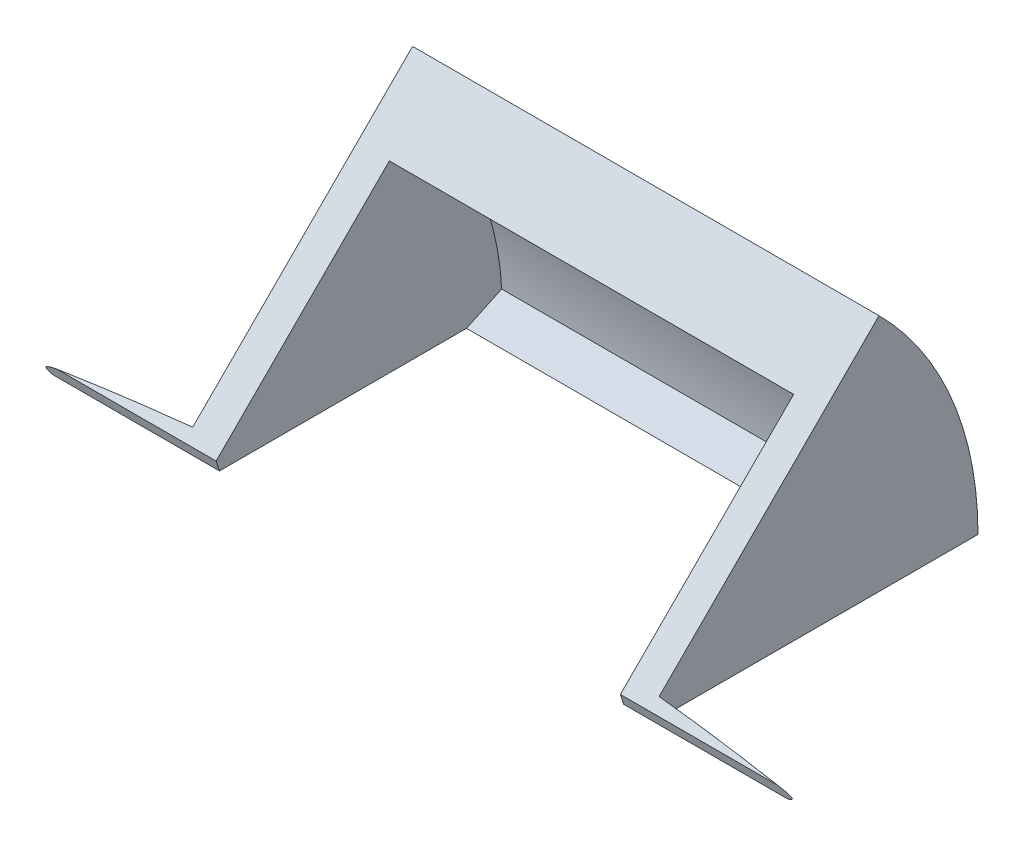
ISO-10303-21;
HEADER;
FILE_DESCRIPTION(('STEP AP214'),'2;1');
FILE_NAME('part.step','',(''),(''),'','','');
FILE_SCHEMA(('AUTOMOTIVE_DESIGN { 1 0 10303 214 1 1 1 1 }'));
ENDSEC;
DATA;
#1=APPLICATION_CONTEXT('core data for automotive mechanical design processes');
#2=APPLICATION_PROTOCOL_DEFINITION('international standard','automotive_design',2000,#1);
#3=PRODUCT_CONTEXT('',#1,'mechanical');
#4=PRODUCT('Part','Part','',(#3));
#5=PRODUCT_RELATED_PRODUCT_CATEGORY('part','',(#4));
#6=PRODUCT_DEFINITION_FORMATION('','',#4);
#7=PRODUCT_DEFINITION_CONTEXT('part definition',#1,'design');
#8=PRODUCT_DEFINITION('design','',#6,#7);
#9=PRODUCT_DEFINITION_SHAPE('','',#8);
#10=(LENGTH_UNIT() NAMED_UNIT(*) SI_UNIT(.MILLI.,.METRE.));
#11=(NAMED_UNIT(*) PLANE_ANGLE_UNIT() SI_UNIT($,.RADIAN.));
#12=(NAMED_UNIT(*) SI_UNIT($,.STERADIAN.) SOLID_ANGLE_UNIT());
#13=UNCERTAINTY_MEASURE_WITH_UNIT(LENGTH_MEASURE(1.E-05),#10,'distance_accuracy_value','');
#14=(GEOMETRIC_REPRESENTATION_CONTEXT(3) GLOBAL_UNCERTAINTY_ASSIGNED_CONTEXT((#13)) GLOBAL_UNIT_ASSIGNED_CONTEXT((#10,
#11,#12)) REPRESENTATION_CONTEXT('',''));
#15=CARTESIAN_POINT('',(0.,0.,0.));
#16=DIRECTION('',(0.,0.,1.));
#17=DIRECTION('',(1.,0.,0.));
#18=AXIS2_PLACEMENT_3D('',#15,#16,#17);
#19=CARTESIAN_POINT('',(1.29664247119215E-12,-696.664748103443,-288.567987091697));
#20=DIRECTION('',(0.,0.707106781186522,0.707106781186573));
#21=DIRECTION('',(0.,-0.707106781186573,0.707106781186522));
#22=AXIS2_PLACEMENT_3D('',#19,#20,#21);
#23=PLANE('',#22);
#24=DIRECTION('',(0.,0.707106781186573,-0.707106781186522));
#25=VECTOR('',#24,1.);
#26=CARTESIAN_POINT('',(66.4075056015437,-696.664748103443,-288.567987091697));
#27=LINE('',#26,#25);
#28=CARTESIAN_POINT('',(66.4075056015471,3.35345131118925,-988.586186506279));
#29=VERTEX_POINT('',#28);
#30=CARTESIAN_POINT('',(66.4075056015471,59.9622891074173,-1045.1950243025));
#31=VERTEX_POINT('',#30);
#32=EDGE_CURVE('E155',#29,#31,#27,.T.);
#33=ORIENTED_EDGE('',*,*,#32,.F.);
#34=DIRECTION('',(-1.,0.,0.));
#35=VECTOR('',#34,1.);
#36=CARTESIAN_POINT('',(285.355505601547,3.35345131118925,-988.586186506278));
#37=LINE('',#36,#35);
#38=CARTESIAN_POINT('',(117.721465657979,3.3534513111893,-988.586186506279));
#39=VERTEX_POINT('',#38);
#40=EDGE_CURVE('E144',#29,#39,#37,.F.);
#41=ORIENTED_EDGE('',*,*,#40,.T.);
#42=CARTESIAN_POINT('',(1.29664247119215E-12,-696.664748103443,-288.567987091697));
#43=DIRECTION('',(0.,0.707106781186522,0.707106781186573));
#44=DIRECTION('',(0.,-0.707106781186573,0.707106781186522));
#45=AXIS2_PLACEMENT_3D('',#42,#43,#44);
#46=CIRCLE('',#45,996.95);
#47=CARTESIAN_POINT('',(76.2,6.22317415019435,-991.455909345284));
#48=VERTEX_POINT('',#47);
#49=EDGE_CURVE('E152',#39,#48,#46,.T.);
#50=ORIENTED_EDGE('',*,*,#49,.T.);
#51=DIRECTION('',(0.,0.707106781186573,-0.707106781186522));
#52=VECTOR('',#51,1.);
#53=CARTESIAN_POINT('',(76.2,6.22317415019435,-991.455909345284));
#54=LINE('',#53,#52);
#55=CARTESIAN_POINT('',(76.1999999999998,78.0652231187502,-1063.29795831383));
#56=VERTEX_POINT('',#55);
#57=EDGE_CURVE('E162',#48,#56,#54,.T.);
#58=ORIENTED_EDGE('',*,*,#57,.T.);
#59=DIRECTION('',(-1.,0.,0.));
#60=VECTOR('',#59,1.);
#61=CARTESIAN_POINT('',(76.1999999999998,78.0652231187502,-1063.29795831383));
#62=LINE('',#61,#60);
#63=CARTESIAN_POINT('',(-76.2000000000002,78.0652231187497,-1063.29795831383));
#64=VERTEX_POINT('',#63);
#65=EDGE_CURVE('E165',#56,#64,#62,.T.);
#66=ORIENTED_EDGE('',*,*,#65,.T.);
#67=DIRECTION('',(0.,-0.707106781186573,0.707106781186522));
#68=VECTOR('',#67,1.);
#69=CARTESIAN_POINT('',(-76.2000000000002,78.0652231187497,-1063.29795831383));
#70=LINE('',#69,#68);
#71=CARTESIAN_POINT('',(-76.2,6.22317415019391,-991.455909345284));
#72=VERTEX_POINT('',#71);
#73=EDGE_CURVE('E175',#64,#72,#70,.T.);
#74=ORIENTED_EDGE('',*,*,#73,.T.);
#75=CARTESIAN_POINT('',(1.29664247119215E-12,-696.664748103443,-288.567987091697));
#76=DIRECTION('',(0.,0.707106781186522,0.707106781186573));
#77=DIRECTION('',(0.,-0.707106781186573,0.707106781186522));
#78=AXIS2_PLACEMENT_3D('',#75,#76,#77);
#79=CIRCLE('',#78,996.95);
#80=CARTESIAN_POINT('',(-117.72146565797,3.35345131118933,-988.58618650628));
#81=VERTEX_POINT('',#80);
#82=EDGE_CURVE('E178',#72,#81,#79,.T.);
#83=ORIENTED_EDGE('',*,*,#82,.T.);
#84=DIRECTION('',(1.,0.,0.));
#85=VECTOR('',#84,1.);
#86=CARTESIAN_POINT('',(-197.752494398453,3.35345131118925,-988.58618650628));
#87=LINE('',#86,#85);
#88=CARTESIAN_POINT('',(-65.6724943984531,3.35345131118925,-988.58618650628));
#89=VERTEX_POINT('',#88);
#90=EDGE_CURVE('E235',#89,#81,#87,.F.);
#91=ORIENTED_EDGE('',*,*,#90,.F.);
#92=DIRECTION('',(0.,-0.707106781186573,0.707106781186522));
#93=VECTOR('',#92,1.);
#94=CARTESIAN_POINT('',(-65.6724943984563,-696.664748103443,-288.567987091697));
#95=LINE('',#94,#93);
#96=CARTESIAN_POINT('',(-65.6724943984529,59.9622891074173,-1045.1950243025));
#97=VERTEX_POINT('',#96);
#98=EDGE_CURVE('E226',#97,#89,#95,.T.);
#99=ORIENTED_EDGE('',*,*,#98,.F.);
#100=DIRECTION('',(1.,0.,0.));
#101=VECTOR('',#100,1.);
#102=CARTESIAN_POINT('',(-65.6724943984528,59.9622891074152,-1045.19502430251));
#103=LINE('',#102,#101);
#104=EDGE_CURVE('E163',#97,#31,#103,.T.);
#105=ORIENTED_EDGE('',*,*,#104,.T.);
#106=EDGE_LOOP('',(#33,#41,#50,#58,#66,#74,#83,#91,#99,#105));
#107=FACE_BOUND('',#106,.T.);
#108=ADVANCED_FACE('F34',(#107),#23,.T.);
#109=CARTESIAN_POINT('',(0.,0.,0.));
#110=DIRECTION('',(0.,1.,0.));
#111=DIRECTION('',(0.,0.,1.));
#112=AXIS2_PLACEMENT_3D('',#109,#110,#111);
#113=PLANE('',#112);
#114=DIRECTION('',(-1.,0.,0.));
#115=VECTOR('',#114,1.);
#116=CARTESIAN_POINT('',(285.355505601547,0.,-989.69301381874));
#117=LINE('',#116,#115);
#118=CARTESIAN_POINT('',(66.4075056015472,0.,-989.69301381874));
#119=VERTEX_POINT('',#118);
#120=CARTESIAN_POINT('',(120.070982749284,0.,-989.69301381874));
#121=VERTEX_POINT('',#120);
#122=EDGE_CURVE('E54',#119,#121,#117,.F.);
#123=ORIENTED_EDGE('',*,*,#122,.F.);
#124=DIRECTION('',(0.,0.,-1.));
#125=VECTOR('',#124,1.);
#126=CARTESIAN_POINT('',(66.4075056015424,0.,2.98367811087682E-13));
#127=LINE('',#126,#125);
#128=CARTESIAN_POINT('',(66.4075056015471,0.,-1070.3809892374));
#129=VERTEX_POINT('',#128);
#130=EDGE_CURVE('E198',#119,#129,#127,.T.);
#131=ORIENTED_EDGE('',*,*,#130,.T.);
#132=DIRECTION('',(-1.,0.,0.));
#133=VECTOR('',#132,1.);
#134=CARTESIAN_POINT('',(66.4075056015471,0.,-1070.3809892374));
#135=LINE('',#134,#133);
#136=CARTESIAN_POINT('',(-65.6724943984528,0.,-1070.3809892374));
#137=VERTEX_POINT('',#136);
#138=EDGE_CURVE('E200',#129,#137,#135,.T.);
#139=ORIENTED_EDGE('',*,*,#138,.T.);
#140=DIRECTION('',(0.,0.,1.));
#141=VECTOR('',#140,1.);
#142=CARTESIAN_POINT('',(-65.6724943984576,0.,-2.95065418055406E-13));
#143=LINE('',#142,#141);
#144=CARTESIAN_POINT('',(-65.6724943984531,0.,-989.693013818741));
#145=VERTEX_POINT('',#144);
#146=EDGE_CURVE('E181',#137,#145,#143,.T.);
#147=ORIENTED_EDGE('',*,*,#146,.T.);
#148=DIRECTION('',(1.,0.,0.));
#149=VECTOR('',#148,1.);
#150=CARTESIAN_POINT('',(-197.752494398453,0.,-989.693013818742));
#151=LINE('',#150,#149);
#152=CARTESIAN_POINT('',(-120.070982749275,0.,-989.693013818741));
#153=VERTEX_POINT('',#152);
#154=EDGE_CURVE('E197',#145,#153,#151,.F.);
#155=ORIENTED_EDGE('',*,*,#154,.T.);
#156=CARTESIAN_POINT('',(0.,0.,0.));
#157=DIRECTION('',(0.,1.,0.));
#158=DIRECTION('',(0.,0.,1.));
#159=AXIS2_PLACEMENT_3D('',#156,#157,#158);
#160=CIRCLE('',#159,996.95);
#161=CARTESIAN_POINT('',(-76.2,0.,-994.033632479304));
#162=VERTEX_POINT('',#161);
#163=EDGE_CURVE('E170',#162,#153,#160,.T.);
#164=ORIENTED_EDGE('',*,*,#163,.F.);
#165=DIRECTION('',(0.,0.,1.));
#166=VECTOR('',#165,1.);
#167=CARTESIAN_POINT('',(-76.2,0.,-1095.6336324793));
#168=LINE('',#167,#166);
#169=CARTESIAN_POINT('',(-76.2,0.,-1095.6336324793));
#170=VERTEX_POINT('',#169);
#171=EDGE_CURVE('E188',#170,#162,#168,.T.);
#172=ORIENTED_EDGE('',*,*,#171,.F.);
#173=DIRECTION('',(-1.,0.,0.));
#174=VECTOR('',#173,1.);
#175=CARTESIAN_POINT('',(76.2,0.,-1095.6336324793));
#176=LINE('',#175,#174);
#177=CARTESIAN_POINT('',(76.2,0.,-1095.6336324793));
#178=VERTEX_POINT('',#177);
#179=EDGE_CURVE('E189',#178,#170,#176,.T.);
#180=ORIENTED_EDGE('',*,*,#179,.F.);
#181=DIRECTION('',(0.,0.,-1.));
#182=VECTOR('',#181,1.);
#183=CARTESIAN_POINT('',(76.2,0.,-994.033632479304));
#184=LINE('',#183,#182);
#185=CARTESIAN_POINT('',(76.2,0.,-994.033632479304));
#186=VERTEX_POINT('',#185);
#187=EDGE_CURVE('E192',#186,#178,#184,.T.);
#188=ORIENTED_EDGE('',*,*,#187,.F.);
#189=CARTESIAN_POINT('',(0.,0.,0.));
#190=DIRECTION('',(0.,1.,0.));
#191=DIRECTION('',(0.,0.,1.));
#192=AXIS2_PLACEMENT_3D('',#189,#190,#191);
#193=CIRCLE('',#192,996.95);
#194=EDGE_CURVE('E194',#121,#186,#193,.T.);
#195=ORIENTED_EDGE('',*,*,#194,.F.);
#196=EDGE_LOOP('',(#123,#131,#139,#147,#155,#164,#172,#180,#188,#195));
#197=FACE_BOUND('',#196,.T.);
#198=ADVANCED_FACE('F258',(#197),#113,.F.);
#199=CARTESIAN_POINT('',(4.43302251575821E-12,0.,-985.23273519509));
#200=DIRECTION('',(-1.,0.,0.));
#201=DIRECTION('',(0.,0.,1.));
#202=AXIS2_PLACEMENT_3D('',#199,#200,#201);
#203=DEGENERATE_TOROIDAL_SURFACE('',#202,985.23273519509,996.95,.F.);
#204=CARTESIAN_POINT('',(113.94406529284,-1.51833179622316,-990.189792221025));
#205=CARTESIAN_POINT('',(114.195517946914,-1.47048861441337,-990.174181212189));
#206=CARTESIAN_POINT('',(114.446784585721,-1.42174603889642,-990.158272802068));
#207=CARTESIAN_POINT('',(114.948875364924,-1.32210671711397,-990.125743941695));
#208=CARTESIAN_POINT('',(115.199699448079,-1.27120971082005,-990.10912340549));
#209=CARTESIAN_POINT('',(115.701919002821,-1.16667918255137,-990.074978914639));
#210=CARTESIAN_POINT('',(115.953311845013,-1.11303421476979,-990.057451177527));
#211=CARTESIAN_POINT('',(116.455346394734,-1.00272900072707,-990.02139951206));
#212=CARTESIAN_POINT('',(116.705988155373,-0.946068973245289,-990.002875655985));
#213=CARTESIAN_POINT('',(117.219668178462,-0.825939250416111,-989.963588938114));
#214=CARTESIAN_POINT('',(117.482654451895,-0.762267528454908,-989.942759349107));
#215=CARTESIAN_POINT('',(118.007224269679,-0.629677509559354,-989.899367783484));
#216=CARTESIAN_POINT('',(118.268807500985,-0.560758089960621,-989.876805436162));
#217=CARTESIAN_POINT('',(118.789336027187,-0.416100732067048,-989.829429414151));
#218=CARTESIAN_POINT('',(119.048285621161,-0.340377018826363,-989.804620435458));
#219=CARTESIAN_POINT('',(119.434073793415,-0.219346826533982,-989.764949787061));
#220=CARTESIAN_POINT('',(119.562207952772,-0.177770705223099,-989.751319346998));
#221=CARTESIAN_POINT('',(119.817311466487,-0.0915216429093998,-989.723036423215));
#222=CARTESIAN_POINT('',(119.944280945797,-0.0468490386197794,-989.70838405062));
#223=CARTESIAN_POINT('',(120.157041130226,0.0318207901941326,-989.68257405439));
#224=CARTESIAN_POINT('',(120.243259424288,0.0647728192321065,-989.671761355817));
#225=CARTESIAN_POINT('',(120.414725683612,0.132947018501499,-989.649386823968));
#226=CARTESIAN_POINT('',(120.499973416736,0.168169718946786,-989.637824815722));
#227=CARTESIAN_POINT('',(120.668637291271,0.241201545098135,-989.613846917769));
#228=CARTESIAN_POINT('',(120.75206123786,0.278994306894178,-989.601436428157));
#229=CARTESIAN_POINT('',(120.917028712373,0.358094624939362,-989.57545552383));
#230=CARTESIAN_POINT('',(120.998572901367,0.399400920824776,-989.561885525042));
#231=CARTESIAN_POINT('',(121.149610820659,0.481625985299725,-989.534866226646));
#232=CARTESIAN_POINT('',(121.219407965142,0.522037676334058,-989.521584277065));
#233=CARTESIAN_POINT('',(121.35605079018,0.607965510016074,-989.493335908331));
#234=CARTESIAN_POINT('',(121.422878912152,0.653507514348653,-989.478360953313));
#235=CARTESIAN_POINT('',(121.552018884215,0.752158266640663,-989.445914041068));
#236=CARTESIAN_POINT('',(121.614232958056,0.805383976165311,-989.428403470888));
#237=CARTESIAN_POINT('',(121.727432724821,0.921658357746014,-989.390137859496));
#238=CARTESIAN_POINT('',(121.778525031737,0.984602875735862,-989.369417212769));
#239=CARTESIAN_POINT('',(121.833953024189,1.08088223273791,-989.337710371997));
#240=CARTESIAN_POINT('',(121.847890108659,1.10913719078718,-989.328404108204));
#241=CARTESIAN_POINT('',(121.871045392107,1.16735159745502,-989.309227071092));
#242=CARTESIAN_POINT('',(121.880268886948,1.19730909096802,-989.299356945218));
#243=CARTESIAN_POINT('',(121.893050013871,1.25861007891947,-989.279156648558));
#244=CARTESIAN_POINT('',(121.89655616614,1.28996358298813,-989.26882314946));
#245=CARTESIAN_POINT('',(121.897238491709,1.35273846085475,-989.248130250736));
#246=CARTESIAN_POINT('',(121.894414219766,1.38415983927128,-989.237770849338));
#247=CARTESIAN_POINT('',(121.883403188042,1.4430015414251,-989.218367974614));
#248=CARTESIAN_POINT('',(121.87575543859,1.47051700933935,-989.209293438269));
#249=CARTESIAN_POINT('',(121.856371543609,1.5241967171067,-989.191587504638));
#250=CARTESIAN_POINT('',(121.844633430736,1.5503602997772,-989.182956322889));
#251=CARTESIAN_POINT('',(121.808380061266,1.61923325117716,-989.160232624539));
#252=CARTESIAN_POINT('',(121.780722310695,1.66043735076755,-989.146634548886));
#253=CARTESIAN_POINT('',(121.719318264499,1.73852893061424,-989.120857902626));
#254=CARTESIAN_POINT('',(121.685550196317,1.77540017070215,-989.108684673179));
#255=CARTESIAN_POINT('',(121.602528947364,1.856912914721,-989.081768084115));
#256=CARTESIAN_POINT('',(121.55180914263,1.90018702063365,-989.067474638778));
#257=CARTESIAN_POINT('',(121.446263674219,1.98201964472908,-989.040439803618));
#258=CARTESIAN_POINT('',(121.391429600326,2.0205680547616,-989.027701740944));
#259=CARTESIAN_POINT('',(121.278829998236,2.09423177467017,-989.003355551371));
#260=CARTESIAN_POINT('',(121.221049621515,2.12932639627823,-988.991754235224));
#261=CARTESIAN_POINT('',(121.103740134054,2.19659894203348,-988.969511964817));
#262=CARTESIAN_POINT('',(121.04421289961,2.22877985415804,-988.958870026773));
#263=CARTESIAN_POINT('',(120.860770956087,2.32342634126685,-988.927566354401));
#264=CARTESIAN_POINT('',(120.734789266682,2.38226606531765,-988.908098486238));
#265=CARTESIAN_POINT('',(120.479699075185,2.49353675797214,-988.871273019535));
#266=CARTESIAN_POINT('',(120.350588288473,2.54596286396296,-988.853917022205));
#267=CARTESIAN_POINT('',(120.090062224509,2.64620685122664,-988.820722213041));
#268=CARTESIAN_POINT('',(119.958642320465,2.69401382941699,-988.804886991384));
#269=CARTESIAN_POINT('',(119.694393169052,2.78599334193724,-988.77441323505));
#270=CARTESIAN_POINT('',(119.561563724715,2.83016536056489,-988.759774870178));
#271=CARTESIAN_POINT('',(119.161242816772,2.95849308938827,-988.717238507323));
#272=CARTESIAN_POINT('',(118.892222518604,3.0383483661885,-988.690756371115));
#273=CARTESIAN_POINT('',(118.487123585887,3.152223058796,-988.65297815011));
#274=CARTESIAN_POINT('',(118.351930138533,3.18917134305036,-988.640717955483));
#275=CARTESIAN_POINT('',(118.081046609695,3.2613828460322,-988.616752183192));
#276=CARTESIAN_POINT('',(117.94535654348,3.29664611610896,-988.605046588626));
#277=CARTESIAN_POINT('',(117.540566610538,3.39954447495341,-988.570883494827));
#278=CARTESIAN_POINT('',(117.270876181876,3.46508304054257,-988.549115940286));
#279=CARTESIAN_POINT('',(116.730355765647,3.59179556444124,-988.507016786381));
#280=CARTESIAN_POINT('',(116.459525720126,3.65296929787118,-988.486685261003));
#281=CARTESIAN_POINT('',(115.645681781599,3.83129370963523,-988.427399844712));
#282=CARTESIAN_POINT('',(115.101400599866,3.94322629227609,-988.390162189445));
#283=CARTESIAN_POINT('',(114.010135956298,4.15756140612789,-988.318818917079));
#284=CARTESIAN_POINT('',(113.46315008927,4.25995271191139,-988.284716989811));
#285=CARTESIAN_POINT('',(112.36777629261,4.45742564726724,-988.21891453302));
#286=CARTESIAN_POINT('',(111.819388502367,4.55250797641334,-988.187213773677));
#287=CARTESIAN_POINT('',(110.722630259704,4.73673948514945,-988.12576132362));
#288=CARTESIAN_POINT('',(110.174261908206,4.82590000176044,-988.096005910454));
#289=CARTESIAN_POINT('',(109.076690755962,4.99952959231751,-988.038034806147));
#290=CARTESIAN_POINT('',(108.527487935624,5.08399855430565,-988.009819151751));
#291=CARTESIAN_POINT('',(107.428681035528,5.24894339507402,-987.954698158013));
#292=CARTESIAN_POINT('',(106.879077261263,5.32942111303674,-987.927792215259));
#293=CARTESIAN_POINT('',(105.779328056162,5.48696998564045,-987.875097720479));
#294=CARTESIAN_POINT('',(105.229182624382,5.56404113433138,-987.849309170405));
#295=CARTESIAN_POINT('',(104.306431553709,5.69074705266428,-987.806895825068));
#296=CARTESIAN_POINT('',(103.933949266338,5.74119389391982,-987.790004690031));
#297=CARTESIAN_POINT('',(103.188772741583,5.8408215998879,-987.756637606665));
#298=CARTESIAN_POINT('',(102.816078492255,5.89000238411501,-987.740161684735));
#299=CARTESIAN_POINT('',(102.070483995807,5.98718826420996,-987.707595422898));
#300=CARTESIAN_POINT('',(101.697583732511,6.03519324820411,-987.691505119686));
#301=CARTESIAN_POINT('',(100.951634472621,6.13009616613208,-987.659687662503));
#302=CARTESIAN_POINT('',(100.578585479053,6.17699412152911,-987.643960501492));
#303=CARTESIAN_POINT('',(99.09800348725,6.36103491760745,-987.582227737957));
#304=CARTESIAN_POINT('',(97.9899102938349,6.49413293501849,-987.537549136444));
#305=CARTESIAN_POINT('',(95.7726968696165,6.75252114267995,-987.450755486436));
#306=CARTESIAN_POINT('',(94.6635766190786,6.87781117960407,-987.408640488283));
#307=CARTESIAN_POINT('',(92.4447025146463,7.12146511272226,-987.326687490572));
#308=CARTESIAN_POINT('',(91.3349488172949,7.23983029495811,-987.286849068255));
#309=CARTESIAN_POINT('',(89.1147520462288,7.47027331444107,-987.209242252859));
#310=CARTESIAN_POINT('',(88.0043089958979,7.58235135430841,-987.171473793071));
#311=CARTESIAN_POINT('',(86.8935607928274,7.69159637211284,-987.134639795117));
#312=B_SPLINE_CURVE_WITH_KNOTS('',3,(#204,#205,#206,#207,#208,#209,#210,#211,#212,#213,#214,
#215,#216,#217,#218,#219,#220,#221,#222,#223,#224,#225,#226,#227,#228,#229,#230,#231,#232,#233,
#234,#235,#236,#237,#238,#239,#240,#241,#242,#243,#244,#245,#246,#247,#248,#249,#250,#251,#252,
#253,#254,#255,#256,#257,#258,#259,#260,#261,#262,#263,#264,#265,#266,#267,#268,#269,#270,#271,
#272,#273,#274,#275,#276,#277,#278,#279,#280,#281,#282,#283,#284,#285,#286,#287,#288,#289,#290,
#291,#292,#293,#294,#295,#296,#297,#298,#299,#300,#301,#302,#303,#304,#305,#306,#307,#308,#309,
#310,#311),.UNSPECIFIED.,.F.,.F.,(4,2,2,2,2,2,2,2,2,2,2,2,2,2,2,2,2,2,2,2,2,2,2,2,2,2,2,2,2,2,2,
2,2,2,2,2,2,2,2,2,2,2,2,2,2,2,2,2,2,2,2,2,2,4),(0.,0.769321233032514,1.53873558531967,
2.31166714666953,3.08454269868243,3.89864901555258,4.71292998998579,5.5255465671098,
5.93171057608851,6.33783048765698,6.6165989439072,6.89543273152371,7.17263274609781,
7.44973374035771,7.69480534361573,7.94117285274265,8.19178966024555,8.43988644908304,
8.53812764870746,8.63625822733001,8.73526760502217,8.83428394665072,8.92382519300899,
9.0134095656337,9.16687475835204,9.32089795722156,9.5249616594658,9.72945450287592,
9.9351059383465,10.1405440336056,10.5613903878164,10.9825538632714,11.4046883448711,
11.8268826130304,12.6722477936846,13.094304200812,13.516347737939,14.3514656507711,
15.1866265585097,16.8572164094104,18.5297475490895,20.2021184037361,21.8711893557525,
23.5403001209131,25.2086344668287,26.8769717266118,28.0057560641763,29.1346119841863,
30.2635748972988,31.3925159039384,34.7433306794061,38.0942112345297,41.4444674961128,
44.7946157245),.UNSPECIFIED.);
#313=EDGE_CURVE('E11',#121,#39,#312,.T.);
#314=ORIENTED_EDGE('',*,*,#313,.F.);
#315=ORIENTED_EDGE('',*,*,#194,.T.);
#316=CARTESIAN_POINT('',(76.1999999999999,0.,-985.23273519509));
#317=DIRECTION('',(-1.,0.,0.));
#318=DIRECTION('',(0.,0.,1.));
#319=AXIS2_PLACEMENT_3D('',#316,#317,#318);
#320=CIRCLE('',#319,8.80089728421422);
#321=EDGE_CURVE('E160',#48,#186,#320,.T.);
#322=ORIENTED_EDGE('',*,*,#321,.F.);
#323=ORIENTED_EDGE('',*,*,#49,.F.);
#324=EDGE_LOOP('',(#314,#315,#322,#323));
#325=FACE_BOUND('',#324,.T.);
#326=ADVANCED_FACE('F158',(#325),#203,.F.);
#327=CARTESIAN_POINT('',(-152.4,0.,-985.232735195091));
#328=DIRECTION('',(-1.,0.,0.));
#329=DIRECTION('',(0.,0.,1.));
#330=AXIS2_PLACEMENT_3D('',#327,#328,#329);
#331=CYLINDRICAL_SURFACE('',#330,96.8072648049095);
#332=DIRECTION('',(1.,0.,0.));
#333=VECTOR('',#332,1.);
#334=CARTESIAN_POINT('',(-65.6724943984528,65.2580786833796,-1056.7381873338));
#335=LINE('',#334,#333);
#336=CARTESIAN_POINT('',(-65.672494398453,65.2580786833795,-1056.7381873338));
#337=VERTEX_POINT('',#336);
#338=CARTESIAN_POINT('',(66.4075056015469,65.2580786833797,-1056.7381873338));
#339=VERTEX_POINT('',#338);
#340=EDGE_CURVE('E233',#337,#339,#335,.T.);
#341=ORIENTED_EDGE('',*,*,#340,.F.);
#342=CARTESIAN_POINT('',(-65.6724943984534,0.,-985.232735195091));
#343=DIRECTION('',(-1.,0.,0.));
#344=DIRECTION('',(0.,0.,1.));
#345=AXIS2_PLACEMENT_3D('',#342,#343,#344);
#346=CIRCLE('',#345,96.8072648049091);
#347=CARTESIAN_POINT('',(-65.6724943984527,5.36725192410683,-1081.89109813276));
#348=VERTEX_POINT('',#347);
#349=EDGE_CURVE('E216',#337,#348,#346,.T.);
#350=ORIENTED_EDGE('',*,*,#349,.T.);
#351=DIRECTION('',(-1.,0.,0.));
#352=VECTOR('',#351,1.);
#353=CARTESIAN_POINT('',(66.4075056015471,5.36725192410683,-1081.89109813276));
#354=LINE('',#353,#352);
#355=CARTESIAN_POINT('',(66.4075056015471,5.36725192410683,-1081.89109813276));
#356=VERTEX_POINT('',#355);
#357=EDGE_CURVE('E211',#356,#348,#354,.T.);
#358=ORIENTED_EDGE('',*,*,#357,.F.);
#359=CARTESIAN_POINT('',(66.4075056015466,0.,-985.23273519509));
#360=DIRECTION('',(-1.,0.,0.));
#361=DIRECTION('',(0.,0.,1.));
#362=AXIS2_PLACEMENT_3D('',#359,#360,#361);
#363=CIRCLE('',#362,96.8072648049097);
#364=EDGE_CURVE('E240',#339,#356,#363,.T.);
#365=ORIENTED_EDGE('',*,*,#364,.F.);
#366=EDGE_LOOP('',(#341,#350,#358,#365));
#367=FACE_BOUND('',#366,.T.);
#368=ADVANCED_FACE('F265',(#367),#331,.F.);
#369=CARTESIAN_POINT('',(-65.6724943984527,0.,-1079.5));
#370=DIRECTION('',(-1.,0.,0.));
#371=DIRECTION('',(0.,0.,1.));
#372=AXIS2_PLACEMENT_3D('',#369,#370,#371);
#373=PLANE('',#372);
#374=ORIENTED_EDGE('',*,*,#98,.T.);
#375=CARTESIAN_POINT('',(-65.6724943984573,-308.713234064149,-48.7240487182689));
#376=DIRECTION('',(1.,0.,0.));
#377=DIRECTION('',(0.,0.,-1.));
#378=AXIS2_PLACEMENT_3D('',#375,#376,#377);
#379=CIRCLE('',#378,990.31634045319);
#380=EDGE_CURVE('E48',#145,#89,#379,.T.);
#381=ORIENTED_EDGE('',*,*,#380,.F.);
#382=ORIENTED_EDGE('',*,*,#146,.F.);
#383=DIRECTION('',(0.,0.4226182617407,-0.906307787036649));
#384=VECTOR('',#383,1.);
#385=CARTESIAN_POINT('',(-65.6724943984528,0.,-1070.3809892374));
#386=LINE('',#385,#384);
#387=EDGE_CURVE('E222',#137,#348,#386,.T.);
#388=ORIENTED_EDGE('',*,*,#387,.T.);
#389=ORIENTED_EDGE('',*,*,#349,.F.);
#390=DIRECTION('',(0.,-0.416991305194049,0.908910474905292));
#391=VECTOR('',#390,1.);
#392=CARTESIAN_POINT('',(-65.6724943984528,59.9622891074152,-1045.19502430251));
#393=LINE('',#392,#391);
#394=EDGE_CURVE('E225',#337,#97,#393,.T.);
#395=ORIENTED_EDGE('',*,*,#394,.T.);
#396=EDGE_LOOP('',(#374,#381,#382,#388,#389,#395));
#397=FACE_BOUND('',#396,.T.);
#398=ADVANCED_FACE('F324',(#397),#373,.F.);
#399=CARTESIAN_POINT('',(66.4075056015473,0.,-1079.5));
#400=DIRECTION('',(1.,0.,0.));
#401=DIRECTION('',(0.,0.,-1.));
#402=AXIS2_PLACEMENT_3D('',#399,#400,#401);
#403=PLANE('',#402);
#404=CARTESIAN_POINT('',(66.4075056015426,-308.713234064149,-48.7240487182684));
#405=DIRECTION('',(1.,0.,0.));
#406=DIRECTION('',(0.,0.,-1.));
#407=AXIS2_PLACEMENT_3D('',#404,#405,#406);
#408=CIRCLE('',#407,990.31634045319);
#409=EDGE_CURVE('E156',#29,#119,#408,.F.);
#410=ORIENTED_EDGE('',*,*,#409,.F.);
#411=ORIENTED_EDGE('',*,*,#32,.T.);
#412=DIRECTION('',(0.,-0.416991305194049,0.908910474905292));
#413=VECTOR('',#412,1.);
#414=CARTESIAN_POINT('',(66.4075056015471,59.9622891074152,-1045.19502430251));
#415=LINE('',#414,#413);
#416=EDGE_CURVE('E214',#339,#31,#415,.T.);
#417=ORIENTED_EDGE('',*,*,#416,.F.);
#418=ORIENTED_EDGE('',*,*,#364,.T.);
#419=DIRECTION('',(0.,0.4226182617407,-0.906307787036649));
#420=VECTOR('',#419,1.);
#421=CARTESIAN_POINT('',(66.4075056015471,0.,-1070.3809892374));
#422=LINE('',#421,#420);
#423=EDGE_CURVE('E184',#129,#356,#422,.T.);
#424=ORIENTED_EDGE('',*,*,#423,.F.);
#425=ORIENTED_EDGE('',*,*,#130,.F.);
#426=EDGE_LOOP('',(#410,#411,#417,#418,#424,#425));
#427=FACE_BOUND('',#426,.T.);
#428=ADVANCED_FACE('F272',(#427),#403,.F.);
#429=CARTESIAN_POINT('',(76.1999999999997,6.22317415019435,-991.455909345284));
#430=DIRECTION('',(-1.,0.,0.));
#431=DIRECTION('',(0.,0.,1.));
#432=AXIS2_PLACEMENT_3D('',#429,#430,#431);
#433=PLANE('',#432);
#434=CARTESIAN_POINT('',(76.1999999999995,0.,-985.23273519509));
#435=DIRECTION('',(-1.,0.,0.));
#436=DIRECTION('',(0.,0.,1.));
#437=AXIS2_PLACEMENT_3D('',#434,#435,#436);
#438=CIRCLE('',#437,110.400897284214);
#439=EDGE_CURVE('E190',#56,#178,#438,.T.);
#440=ORIENTED_EDGE('',*,*,#439,.F.);
#441=ORIENTED_EDGE('',*,*,#57,.F.);
#442=ORIENTED_EDGE('',*,*,#321,.T.);
#443=ORIENTED_EDGE('',*,*,#187,.T.);
#444=EDGE_LOOP('',(#440,#441,#442,#443));
#445=FACE_BOUND('',#444,.T.);
#446=ADVANCED_FACE('F342',(#445),#433,.F.);
#447=CARTESIAN_POINT('',(-102.97969460044,0.,-985.232735195091));
#448=DIRECTION('',(-1.,0.,0.));
#449=DIRECTION('',(0.,0.,1.));
#450=AXIS2_PLACEMENT_3D('',#447,#448,#449);
#451=CYLINDRICAL_SURFACE('',#450,110.400897284214);
#452=CARTESIAN_POINT('',(-76.2000000000005,0.,-985.232735195091));
#453=DIRECTION('',(-1.,0.,0.));
#454=DIRECTION('',(0.,0.,1.));
#455=AXIS2_PLACEMENT_3D('',#452,#453,#454);
#456=CIRCLE('',#455,110.400897284214);
#457=EDGE_CURVE('E186',#64,#170,#456,.T.);
#458=ORIENTED_EDGE('',*,*,#457,.F.);
#459=ORIENTED_EDGE('',*,*,#65,.F.);
#460=ORIENTED_EDGE('',*,*,#439,.T.);
#461=ORIENTED_EDGE('',*,*,#179,.T.);
#462=EDGE_LOOP('',(#458,#459,#460,#461));
#463=FACE_BOUND('',#462,.T.);
#464=ADVANCED_FACE('F345',(#463),#451,.T.);
#465=CARTESIAN_POINT('',(-76.1999999999999,78.0652231187497,-1063.29795831383));
#466=DIRECTION('',(1.,0.,0.));
#467=DIRECTION('',(0.,0.,-1.));
#468=AXIS2_PLACEMENT_3D('',#465,#466,#467);
#469=PLANE('',#468);
#470=CARTESIAN_POINT('',(-76.2,0.,-985.232735195091));
#471=DIRECTION('',(-1.,0.,0.));
#472=DIRECTION('',(0.,0.,1.));
#473=AXIS2_PLACEMENT_3D('',#470,#471,#472);
#474=CIRCLE('',#473,8.80089728421358);
#475=EDGE_CURVE('E182',#72,#162,#474,.T.);
#476=ORIENTED_EDGE('',*,*,#475,.F.);
#477=ORIENTED_EDGE('',*,*,#73,.F.);
#478=ORIENTED_EDGE('',*,*,#457,.T.);
#479=ORIENTED_EDGE('',*,*,#171,.T.);
#480=EDGE_LOOP('',(#476,#477,#478,#479));
#481=FACE_BOUND('',#480,.T.);
#482=ADVANCED_FACE('F348',(#481),#469,.F.);
#483=CARTESIAN_POINT('',(4.43302251575821E-12,0.,-985.23273519509));
#484=DIRECTION('',(-1.,0.,0.));
#485=DIRECTION('',(0.,0.,1.));
#486=AXIS2_PLACEMENT_3D('',#483,#484,#485);
#487=DEGENERATE_TOROIDAL_SURFACE('',#486,985.23273519509,996.95,.F.);
#488=ORIENTED_EDGE('',*,*,#163,.T.);
#489=CARTESIAN_POINT('',(-113.944065292773,-1.51833179623413,-990.18979222103));
#490=CARTESIAN_POINT('',(-114.195517946849,-1.47048861442425,-990.174181212193));
#491=CARTESIAN_POINT('',(-114.446784585657,-1.42174603890708,-990.158272802072));
#492=CARTESIAN_POINT('',(-114.948875364864,-1.32210671712416,-990.125743941699));
#493=CARTESIAN_POINT('',(-115.199699448021,-1.27120971082999,-990.109123405494));
#494=CARTESIAN_POINT('',(-115.701919002767,-1.16667918256092,-990.074978914643));
#495=CARTESIAN_POINT('',(-115.95331184496,-1.11303421477922,-990.057451177531));
#496=CARTESIAN_POINT('',(-116.455346394685,-1.00272900073619,-990.021399512064));
#497=CARTESIAN_POINT('',(-116.705988155326,-0.946068973254219,-990.002875655989));
#498=CARTESIAN_POINT('',(-117.219668178419,-0.825939250424273,-989.963588938117));
#499=CARTESIAN_POINT('',(-117.482654451856,-0.762267528462465,-989.94275934911));
#500=CARTESIAN_POINT('',(-118.007224269646,-0.629677509565704,-989.899367783487));
#501=CARTESIAN_POINT('',(-118.268807500955,-0.56075808996637,-989.876805436165));
#502=CARTESIAN_POINT('',(-118.789336027163,-0.416100732071378,-989.829429414153));
#503=CARTESIAN_POINT('',(-119.04828562114,-0.340377018829877,-989.80462043546));
#504=CARTESIAN_POINT('',(-119.434073793399,-0.219346826536348,-989.764949787063));
#505=CARTESIAN_POINT('',(-119.562207952758,-0.177770705225095,-989.751319347));
#506=CARTESIAN_POINT('',(-119.817311466476,-0.0915216429105283,-989.723036423217));
#507=CARTESIAN_POINT('',(-119.944280945788,-0.0468490386204094,-989.708384050621));
#508=CARTESIAN_POINT('',(-120.157041130218,0.0318207901941956,-989.682574054391));
#509=CARTESIAN_POINT('',(-120.24325942428,0.0647728192322728,-989.671761355818));
#510=CARTESIAN_POINT('',(-120.414725683604,0.132947018501471,-989.649386823969));
#511=CARTESIAN_POINT('',(-120.499973416728,0.168169718946461,-989.637824815723));
#512=CARTESIAN_POINT('',(-120.668637291263,0.241201545097993,-989.61384691777));
#513=CARTESIAN_POINT('',(-120.752061237852,0.278994306894511,-989.601436428158));
#514=CARTESIAN_POINT('',(-120.917028712365,0.358094624939328,-989.575455523831));
#515=CARTESIAN_POINT('',(-120.998572901359,0.3994009208239,-989.561885525044));
#516=CARTESIAN_POINT('',(-121.14961082065,0.481625985298791,-989.534866226647));
#517=CARTESIAN_POINT('',(-121.219407965133,0.522037676333706,-989.521584277066));
#518=CARTESIAN_POINT('',(-121.35605079017,0.607965510015901,-989.493335908333));
#519=CARTESIAN_POINT('',(-121.422878912142,0.653507514348074,-989.478360953314));
#520=CARTESIAN_POINT('',(-121.552018884204,0.752158266639328,-989.445914041069));
#521=CARTESIAN_POINT('',(-121.614232958046,0.805383976163622,-989.42840347089));
#522=CARTESIAN_POINT('',(-121.727432724811,0.921658357743042,-989.390137859499));
#523=CARTESIAN_POINT('',(-121.778525031728,0.984602875731961,-989.369417212771));
#524=CARTESIAN_POINT('',(-121.83395302418,1.08088223273375,-989.337710371999));
#525=CARTESIAN_POINT('',(-121.847890108649,1.10913719078318,-989.328404108206));
#526=CARTESIAN_POINT('',(-121.871045392097,1.16735159745095,-989.309227071094));
#527=CARTESIAN_POINT('',(-121.880268886939,1.19730909096373,-989.29935694522));
#528=CARTESIAN_POINT('',(-121.893050013863,1.25861007891506,-989.27915664856));
#529=CARTESIAN_POINT('',(-121.896556166133,1.2899635829838,-989.268823149463));
#530=CARTESIAN_POINT('',(-121.897238491702,1.35273846085057,-989.248130250738));
#531=CARTESIAN_POINT('',(-121.894414219759,1.38415983926718,-989.237770849341));
#532=CARTESIAN_POINT('',(-121.883403188035,1.44300154142111,-989.218367974616));
#533=CARTESIAN_POINT('',(-121.875755438584,1.4705170093354,-989.209293438271));
#534=CARTESIAN_POINT('',(-121.856371543603,1.52419671710291,-989.19158750464));
#535=CARTESIAN_POINT('',(-121.84463343073,1.55036029977351,-989.182956322891));
#536=CARTESIAN_POINT('',(-121.80838006126,1.61923325117296,-989.160232624542));
#537=CARTESIAN_POINT('',(-121.780722310689,1.66043735076266,-989.146634548888));
#538=CARTESIAN_POINT('',(-121.719318264494,1.73852893060855,-989.120857902628));
#539=CARTESIAN_POINT('',(-121.685550196312,1.77540017069637,-989.108684673182));
#540=CARTESIAN_POINT('',(-121.602528947362,1.85691291471448,-989.081768084118));
#541=CARTESIAN_POINT('',(-121.55180914263,1.90018702062662,-989.067474638782));
#542=CARTESIAN_POINT('',(-121.446263674222,1.98201964472077,-989.040439803622));
#543=CARTESIAN_POINT('',(-121.39142960033,2.02056805475253,-989.027701740948));
#544=CARTESIAN_POINT('',(-121.278829998243,2.09423177466031,-989.003355551375));
#545=CARTESIAN_POINT('',(-121.221049621525,2.12932639626835,-988.991754235228));
#546=CARTESIAN_POINT('',(-121.103740134067,2.19659894202244,-988.969511964821));
#547=CARTESIAN_POINT('',(-121.044212899624,2.22877985414586,-988.958870026778));
#548=CARTESIAN_POINT('',(-120.860770956107,2.32342634125168,-988.927566354407));
#549=CARTESIAN_POINT('',(-120.734789266707,2.38226606530195,-988.908098486244));
#550=CARTESIAN_POINT('',(-120.479699075219,2.49353675795429,-988.871273019542));
#551=CARTESIAN_POINT('',(-120.350588288513,2.54596286394348,-988.853917022212));
#552=CARTESIAN_POINT('',(-120.090062224559,2.64620685120494,-988.820722213049));
#553=CARTESIAN_POINT('',(-119.95864232052,2.6940138293947,-988.804886991392));
#554=CARTESIAN_POINT('',(-119.694393169116,2.78599334191296,-988.774413235059));
#555=CARTESIAN_POINT('',(-119.561563724784,2.83016536053921,-988.759774870187));
#556=CARTESIAN_POINT('',(-119.161242816856,2.95849308935924,-988.717238507333));
#557=CARTESIAN_POINT('',(-118.892222518698,3.03834836615833,-988.690756371126));
#558=CARTESIAN_POINT('',(-118.487123585996,3.15222305876346,-988.652978150122));
#559=CARTESIAN_POINT('',(-118.351930138647,3.18917134301693,-988.640717955495));
#560=CARTESIAN_POINT('',(-118.081046609819,3.26138284599729,-988.616752183204));
#561=CARTESIAN_POINT('',(-117.945356543609,3.29664611607346,-988.605046588639));
#562=CARTESIAN_POINT('',(-117.540566610682,3.39954447491583,-988.57088349484));
#563=CARTESIAN_POINT('',(-117.270876182029,3.46508304050322,-988.5491159403));
#564=CARTESIAN_POINT('',(-116.73035576582,3.59179556439918,-988.507016786396));
#565=CARTESIAN_POINT('',(-116.459525720309,3.65296929782818,-988.486685261018));
#566=CARTESIAN_POINT('',(-115.645681781811,3.83129370958898,-988.427399844729));
#567=CARTESIAN_POINT('',(-115.101400600098,3.94322629222709,-988.390162189463));
#568=CARTESIAN_POINT('',(-114.010135956569,4.15756140607424,-988.318818917098));
#569=CARTESIAN_POINT('',(-113.463150089561,4.25995271185583,-988.28471698983));
#570=CARTESIAN_POINT('',(-112.367776292941,4.45742564720772,-988.218914533041));
#571=CARTESIAN_POINT('',(-111.819388502718,4.55250797635178,-988.187213773699));
#572=CARTESIAN_POINT('',(-110.722630260094,4.73673948508395,-988.125761323643));
#573=CARTESIAN_POINT('',(-110.174261908616,4.82590000169306,-988.096005910477));
#574=CARTESIAN_POINT('',(-109.076690756411,4.99952959224645,-988.038034806171));
#575=CARTESIAN_POINT('',(-108.527487936092,5.0839985542328,-988.009819151776));
#576=CARTESIAN_POINT('',(-107.428681036037,5.24894339499768,-987.95469815804));
#577=CARTESIAN_POINT('',(-106.879077261791,5.32942111295871,-987.927792215286));
#578=CARTESIAN_POINT('',(-105.77932805673,5.48696998555917,-987.875097720507));
#579=CARTESIAN_POINT('',(-105.229182624969,5.56404113424856,-987.849309170434));
#580=CARTESIAN_POINT('',(-104.306431554265,5.69074705258757,-987.806895825095));
#581=CARTESIAN_POINT('',(-103.933949266844,5.74119389385057,-987.790004690055));
#582=CARTESIAN_POINT('',(-103.188772741986,5.84082159983329,-987.756637606685));
#583=CARTESIAN_POINT('',(-102.816078492608,5.89000238406758,-987.740161684752));
#584=CARTESIAN_POINT('',(-102.070483996058,5.98718826417647,-987.70759542291));
#585=CARTESIAN_POINT('',(-101.697583732711,6.03519324817738,-987.691505119696));
#586=CARTESIAN_POINT('',(-100.951634472718,6.13009616611873,-987.659687662508));
#587=CARTESIAN_POINT('',(-100.578585479099,6.17699412152237,-987.643960501495));
#588=CARTESIAN_POINT('',(-99.0980034872459,6.36103491760726,-987.582227737958));
#589=CARTESIAN_POINT('',(-97.9899102938313,6.49413293501794,-987.537549136445));
#590=CARTESIAN_POINT('',(-95.7726968696139,6.75252114267915,-987.450755486437));
#591=CARTESIAN_POINT('',(-94.6635766190766,6.87781117960339,-987.408640488284));
#592=CARTESIAN_POINT('',(-92.4447025146452,7.12146511272157,-987.326687490574));
#593=CARTESIAN_POINT('',(-91.3349488172943,7.23983029495729,-987.286849068256));
#594=CARTESIAN_POINT('',(-89.1147520462293,7.47027331444006,-987.20924225286));
#595=CARTESIAN_POINT('',(-88.0043089958989,7.58235135430732,-987.171473793072));
#596=CARTESIAN_POINT('',(-86.893560792829,7.69159637211186,-987.134639795118));
#597=B_SPLINE_CURVE_WITH_KNOTS('',3,(#489,#490,#491,#492,#493,#494,#495,#496,#497,#498,#499,
#500,#501,#502,#503,#504,#505,#506,#507,#508,#509,#510,#511,#512,#513,#514,#515,#516,#517,#518,
#519,#520,#521,#522,#523,#524,#525,#526,#527,#528,#529,#530,#531,#532,#533,#534,#535,#536,#537,
#538,#539,#540,#541,#542,#543,#544,#545,#546,#547,#548,#549,#550,#551,#552,#553,#554,#555,#556,
#557,#558,#559,#560,#561,#562,#563,#564,#565,#566,#567,#568,#569,#570,#571,#572,#573,#574,#575,
#576,#577,#578,#579,#580,#581,#582,#583,#584,#585,#586,#587,#588,#589,#590,#591,#592,#593,#594,
#595,#596),.UNSPECIFIED.,.F.,.F.,(4,2,2,2,2,2,2,2,2,2,2,2,2,2,2,2,2,2,2,2,2,2,2,2,2,2,2,2,2,2,2,
2,2,2,2,2,2,2,2,2,2,2,2,2,2,2,2,2,2,2,2,2,2,4),(0.,0.769321233037822,1.53873558533031,
2.31166714668568,3.08454269870405,3.8986490155838,4.71292999002664,5.52554656716015,
5.9317105761436,6.33783048771677,6.616598943967,6.89543273158359,7.1726327461576,
7.44973374041728,7.69480534367439,7.94117285280046,8.19178966030227,8.43988644913857,
8.53812764876304,8.63625822738576,8.73526760507811,8.83428394670679,8.92382519306515,
9.01340956569004,9.16687475840655,9.32089795727428,9.52496165951364,9.72945450291901,
9.93510593838474,10.140544033639,10.5613903878349,10.9825538632748,11.4046883448595,
11.8268826130037,12.6722477936279,13.0943042007404,13.5163477378526,14.3514656506549,
15.1866265583639,16.8572164092054,18.529747548825,20.2021184034122,21.8711893553692,
23.5403001204704,25.2086344663266,26.8769717260503,28.0057560637694,29.134611983934,
30.2635748972011,31.3925159039952,34.7433306794614,38.0942112345835,41.4444674961651,
44.7946157245506),.UNSPECIFIED.);
#598=EDGE_CURVE('E185',#153,#81,#597,.T.);
#599=ORIENTED_EDGE('',*,*,#598,.T.);
#600=ORIENTED_EDGE('',*,*,#82,.F.);
#601=ORIENTED_EDGE('',*,*,#475,.T.);
#602=EDGE_LOOP('',(#488,#599,#600,#601));
#603=FACE_BOUND('',#602,.T.);
#604=ADVANCED_FACE('F249',(#603),#487,.F.);
#605=CARTESIAN_POINT('',(66.4075056015471,0.,-1070.3809892374));
#606=DIRECTION('',(0.,0.90630778703665,0.4226182617407));
#607=DIRECTION('',(0.,-0.4226182617407,0.90630778703665));
#608=AXIS2_PLACEMENT_3D('',#605,#606,#607);
#609=PLANE('',#608);
#610=ORIENTED_EDGE('',*,*,#387,.F.);
#611=ORIENTED_EDGE('',*,*,#138,.F.);
#612=ORIENTED_EDGE('',*,*,#423,.T.);
#613=ORIENTED_EDGE('',*,*,#357,.T.);
#614=EDGE_LOOP('',(#610,#611,#612,#613));
#615=FACE_BOUND('',#614,.T.);
#616=ADVANCED_FACE('F277',(#615),#609,.T.);
#617=CARTESIAN_POINT('',(-65.6724943984528,59.9622891074152,-1045.19502430251));
#618=DIRECTION('',(0.,0.908910474905292,0.416991305194049));
#619=DIRECTION('',(0.,-0.416991305194049,0.908910474905292));
#620=AXIS2_PLACEMENT_3D('',#617,#618,#619);
#621=PLANE('',#620);
#622=ORIENTED_EDGE('',*,*,#416,.T.);
#623=ORIENTED_EDGE('',*,*,#104,.F.);
#624=ORIENTED_EDGE('',*,*,#394,.F.);
#625=ORIENTED_EDGE('',*,*,#340,.T.);
#626=EDGE_LOOP('',(#622,#623,#624,#625));
#627=FACE_BOUND('',#626,.T.);
#628=ADVANCED_FACE('F256',(#627),#621,.F.);
#629=CARTESIAN_POINT('',(-197.752494398457,-308.713234064149,-48.7240487182695));
#630=DIRECTION('',(1.,0.,0.));
#631=DIRECTION('',(0.,0.,-1.));
#632=AXIS2_PLACEMENT_3D('',#629,#630,#631);
#633=CYLINDRICAL_SURFACE('',#632,990.31634045319);
#634=ORIENTED_EDGE('',*,*,#90,.T.);
#635=ORIENTED_EDGE('',*,*,#598,.F.);
#636=ORIENTED_EDGE('',*,*,#154,.F.);
#637=ORIENTED_EDGE('',*,*,#380,.T.);
#638=EDGE_LOOP('',(#634,#635,#636,#637));
#639=FACE_BOUND('',#638,.T.);
#640=ADVANCED_FACE('F252',(#639),#633,.F.);
#641=CARTESIAN_POINT('',(285.355505601543,-308.713234064149,-48.7240487182674));
#642=DIRECTION('',(-1.,0.,0.));
#643=DIRECTION('',(0.,0.,1.));
#644=AXIS2_PLACEMENT_3D('',#641,#642,#643);
#645=CYLINDRICAL_SURFACE('',#644,990.31634045319);
#646=ORIENTED_EDGE('',*,*,#409,.T.);
#647=ORIENTED_EDGE('',*,*,#122,.T.);
#648=ORIENTED_EDGE('',*,*,#313,.T.);
#649=ORIENTED_EDGE('',*,*,#40,.F.);
#650=EDGE_LOOP('',(#646,#647,#648,#649));
#651=FACE_BOUND('',#650,.T.);
#652=ADVANCED_FACE('F143',(#651),#645,.F.);
#653=CLOSED_SHELL('',(#108,#198,#326,#368,#398,#428,#446,#464,#482,#604,#616,#628,#640,#652));
#654=CARTESIAN_POINT('',(66.4075056015471,2.54,-1070.3809892374));
#655=DIRECTION('',(0.,-1.,0.));
#656=DIRECTION('',(0.,0.,-1.));
#657=AXIS2_PLACEMENT_3D('',#654,#655,#656);
#658=PLANE('',#657);
#659=DIRECTION('',(0.,0.,-1.));
#660=VECTOR('',#659,1.);
#661=CARTESIAN_POINT('',(66.4075056015473,2.54,-1079.5));
#662=LINE('',#661,#660);
#663=CARTESIAN_POINT('',(66.4075056015473,2.54,-1081.8381888367));
#664=VERTEX_POINT('',#663);
#665=CARTESIAN_POINT('',(66.4075056015471,2.54,-1082.00667238382));
#666=VERTEX_POINT('',#665);
#667=EDGE_CURVE('E210',#664,#666,#662,.T.);
#668=ORIENTED_EDGE('',*,*,#667,.T.);
#669=DIRECTION('',(-1.,0.,0.));
#670=VECTOR('',#669,1.);
#671=CARTESIAN_POINT('',(-152.399999999999,2.54,-1082.00667238382));
#672=LINE('',#671,#670);
#673=CARTESIAN_POINT('',(-65.6724943984529,2.54,-1082.00667238382));
#674=VERTEX_POINT('',#673);
#675=EDGE_CURVE('E206',#666,#674,#672,.T.);
#676=ORIENTED_EDGE('',*,*,#675,.T.);
#677=DIRECTION('',(0.,0.,-1.));
#678=VECTOR('',#677,1.);
#679=CARTESIAN_POINT('',(-65.6724943984528,2.54,-1070.3809892374));
#680=LINE('',#679,#678);
#681=CARTESIAN_POINT('',(-65.6724943984527,2.54,-1081.8381888367));
#682=VERTEX_POINT('',#681);
#683=EDGE_CURVE('E209',#674,#682,#680,.F.);
#684=ORIENTED_EDGE('',*,*,#683,.T.);
#685=DIRECTION('',(-1.,0.,0.));
#686=VECTOR('',#685,1.);
#687=CARTESIAN_POINT('',(66.4075056015471,2.54000000000001,-1081.8381888367));
#688=LINE('',#687,#686);
#689=EDGE_CURVE('E204',#664,#682,#688,.T.);
#690=ORIENTED_EDGE('',*,*,#689,.F.);
#691=EDGE_LOOP('',(#668,#676,#684,#690));
#692=FACE_BOUND('',#691,.T.);
#693=ADVANCED_FACE('F314',(#692),#658,.F.);
#694=CARTESIAN_POINT('',(66.4075056015471,-2.30202177907309,-1071.45443962222));
#695=DIRECTION('',(0.,0.90630778703665,0.4226182617407));
#696=DIRECTION('',(0.,-0.4226182617407,0.90630778703665));
#697=AXIS2_PLACEMENT_3D('',#694,#695,#696);
#698=PLANE('',#697);
#699=DIRECTION('',(0.,0.4226182617407,-0.90630778703665));
#700=VECTOR('',#699,1.);
#701=CARTESIAN_POINT('',(-65.6724943984528,-2.30202177907309,-1071.45443962222));
#702=LINE('',#701,#700);
#703=CARTESIAN_POINT('',(-65.6724943984529,2.61760088819042,-1082.00460447846));
#704=VERTEX_POINT('',#703);
#705=EDGE_CURVE('E205',#682,#704,#702,.T.);
#706=ORIENTED_EDGE('',*,*,#705,.T.);
#707=DIRECTION('',(-1.,0.,0.));
#708=VECTOR('',#707,1.);
#709=CARTESIAN_POINT('',(-152.399999999999,2.61760088819057,-1082.00460447846));
#710=LINE('',#709,#708);
#711=CARTESIAN_POINT('',(66.4075056015471,2.61760088819067,-1082.00460447846));
#712=VERTEX_POINT('',#711);
#713=EDGE_CURVE('E201',#704,#712,#710,.F.);
#714=ORIENTED_EDGE('',*,*,#713,.T.);
#715=DIRECTION('',(0.,0.4226182617407,-0.90630778703665));
#716=VECTOR('',#715,1.);
#717=CARTESIAN_POINT('',(66.4075056015471,-2.30202177907309,-1071.45443962222));
#718=LINE('',#717,#716);
#719=EDGE_CURVE('E219',#664,#712,#718,.T.);
#720=ORIENTED_EDGE('',*,*,#719,.F.);
#721=ORIENTED_EDGE('',*,*,#689,.T.);
#722=EDGE_LOOP('',(#706,#714,#720,#721));
#723=FACE_BOUND('',#722,.T.);
#724=ADVANCED_FACE('F319',(#723),#698,.F.);
#725=ORIENTED_EDGE('',*,*,#719,.T.);
#726=EDGE_CURVE('E232',#712,#666,#363,.T.);
#727=ORIENTED_EDGE('',*,*,#726,.T.);
#728=ORIENTED_EDGE('',*,*,#667,.F.);
#729=EDGE_LOOP('',(#725,#727,#728));
#730=FACE_BOUND('',#729,.T.);
#731=ADVANCED_FACE('F316',(#730),#403,.F.);
#732=ORIENTED_EDGE('',*,*,#705,.F.);
#733=ORIENTED_EDGE('',*,*,#683,.F.);
#734=EDGE_CURVE('E167',#704,#674,#346,.T.);
#735=ORIENTED_EDGE('',*,*,#734,.F.);
#736=EDGE_LOOP('',(#732,#733,#735));
#737=FACE_BOUND('',#736,.T.);
#738=ADVANCED_FACE('F321',(#737),#373,.F.);
#739=ORIENTED_EDGE('',*,*,#713,.F.);
#740=ORIENTED_EDGE('',*,*,#734,.T.);
#741=ORIENTED_EDGE('',*,*,#675,.F.);
#742=ORIENTED_EDGE('',*,*,#726,.F.);
#743=EDGE_LOOP('',(#739,#740,#741,#742));
#744=FACE_BOUND('',#743,.T.);
#745=ADVANCED_FACE('F318',(#744),#331,.F.);
#746=CLOSED_SHELL('',(#693,#724,#731,#738,#745));
#747=ORIENTED_CLOSED_SHELL('',*,#746,.T.);
#748=BREP_WITH_VOIDS('B2',#653,(#747));
#749=ADVANCED_BREP_SHAPE_REPRESENTATION('',(#18,#748),#14);
#750=SHAPE_DEFINITION_REPRESENTATION(#9,#749);
ENDSEC;
END-ISO-10303-21;
